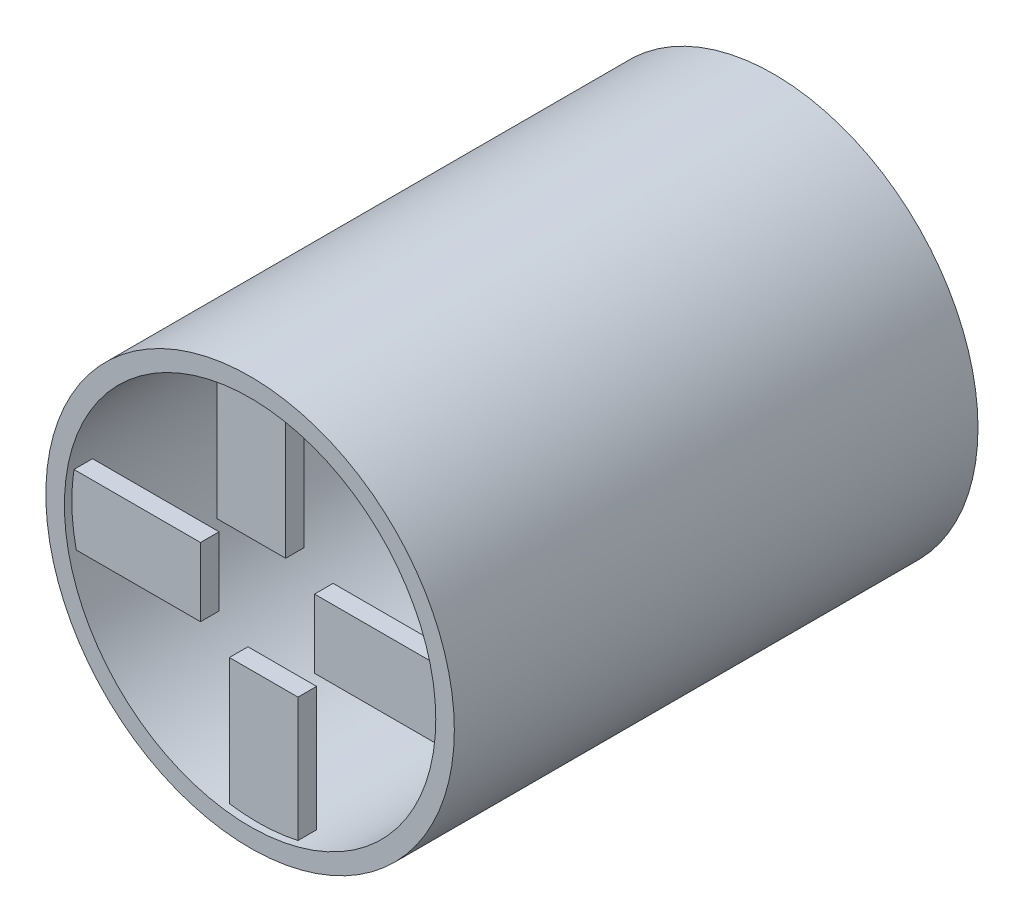
ISO-10303-21;
HEADER;
FILE_DESCRIPTION(('STEP AP214'),'2;1');
FILE_NAME('part.step','',(''),(''),'','','');
FILE_SCHEMA(('AUTOMOTIVE_DESIGN { 1 0 10303 214 1 1 1 1 }'));
ENDSEC;
DATA;
#1=APPLICATION_CONTEXT('core data for automotive mechanical design processes');
#2=APPLICATION_PROTOCOL_DEFINITION('international standard','automotive_design',2000,#1);
#3=PRODUCT_CONTEXT('',#1,'mechanical');
#4=PRODUCT('Part','Part','',(#3));
#5=PRODUCT_RELATED_PRODUCT_CATEGORY('part','',(#4));
#6=PRODUCT_DEFINITION_FORMATION('','',#4);
#7=PRODUCT_DEFINITION_CONTEXT('part definition',#1,'design');
#8=PRODUCT_DEFINITION('design','',#6,#7);
#9=PRODUCT_DEFINITION_SHAPE('','',#8);
#10=(LENGTH_UNIT() NAMED_UNIT(*) SI_UNIT(.MILLI.,.METRE.));
#11=(NAMED_UNIT(*) PLANE_ANGLE_UNIT() SI_UNIT($,.RADIAN.));
#12=(NAMED_UNIT(*) SI_UNIT($,.STERADIAN.) SOLID_ANGLE_UNIT());
#13=UNCERTAINTY_MEASURE_WITH_UNIT(LENGTH_MEASURE(1.E-05),#10,'distance_accuracy_value','');
#14=(GEOMETRIC_REPRESENTATION_CONTEXT(3) GLOBAL_UNCERTAINTY_ASSIGNED_CONTEXT((#13)) GLOBAL_UNIT_ASSIGNED_CONTEXT((#10,
#11,#12)) REPRESENTATION_CONTEXT('',''));
#15=CARTESIAN_POINT('',(0.,0.,0.));
#16=DIRECTION('',(0.,0.,1.));
#17=DIRECTION('',(1.,0.,0.));
#18=AXIS2_PLACEMENT_3D('',#15,#16,#17);
#19=CARTESIAN_POINT('',(0.,0.,6.95));
#20=DIRECTION('',(0.,0.,1.));
#21=DIRECTION('',(1.,0.,0.));
#22=AXIS2_PLACEMENT_3D('',#19,#20,#21);
#23=PLANE('',#22);
#24=DIRECTION('',(0.,-1.,0.));
#25=VECTOR('',#24,1.);
#26=CARTESIAN_POINT('',(0.378691706238011,2.47115207780228,6.95));
#27=LINE('',#26,#25);
#28=CARTESIAN_POINT('',(0.378691706238011,2.47115207780228,6.95));
#29=VERTEX_POINT('',#28);
#30=CARTESIAN_POINT('',(0.378691706238011,0.767744305134912,6.95));
#31=VERTEX_POINT('',#30);
#32=EDGE_CURVE('E162',#29,#31,#27,.T.);
#33=ORIENTED_EDGE('',*,*,#32,.F.);
#34=CARTESIAN_POINT('',(0.,0.,6.95));
#35=DIRECTION('',(0.,0.,1.));
#36=DIRECTION('',(1.,0.,0.));
#37=AXIS2_PLACEMENT_3D('',#34,#35,#36);
#38=CIRCLE('',#37,2.5);
#39=CARTESIAN_POINT('',(-0.544910465352832,2.43989192071062,6.95));
#40=VERTEX_POINT('',#39);
#41=EDGE_CURVE('E11',#29,#40,#38,.T.);
#42=ORIENTED_EDGE('',*,*,#41,.T.);
#43=DIRECTION('',(0.,1.,0.));
#44=VECTOR('',#43,1.);
#45=CARTESIAN_POINT('',(-0.544910465352832,2.43989192071062,6.95));
#46=LINE('',#45,#44);
#47=CARTESIAN_POINT('',(-0.544910465352832,0.767744305134912,6.95));
#48=VERTEX_POINT('',#47);
#49=EDGE_CURVE('E172',#48,#40,#46,.T.);
#50=ORIENTED_EDGE('',*,*,#49,.F.);
#51=DIRECTION('',(-1.,0.,0.));
#52=VECTOR('',#51,1.);
#53=CARTESIAN_POINT('',(-0.544910465352832,0.767744305134912,6.95));
#54=LINE('',#53,#52);
#55=EDGE_CURVE('E170',#31,#48,#54,.T.);
#56=ORIENTED_EDGE('',*,*,#55,.F.);
#57=EDGE_LOOP('',(#33,#42,#50,#56));
#58=FACE_BOUND('',#57,.T.);
#59=ADVANCED_FACE('F33',(#58),#23,.T.);
#60=DIRECTION('',(1.,0.,0.));
#61=VECTOR('',#60,1.);
#62=CARTESIAN_POINT('',(-2.47115207780228,0.378691706238037,6.95));
#63=LINE('',#62,#61);
#64=CARTESIAN_POINT('',(-2.47115207780228,0.378691706238037,6.95));
#65=VERTEX_POINT('',#64);
#66=CARTESIAN_POINT('',(-0.767744305134908,0.378691706238019,6.95));
#67=VERTEX_POINT('',#66);
#68=EDGE_CURVE('E180',#65,#67,#63,.T.);
#69=ORIENTED_EDGE('',*,*,#68,.F.);
#70=CARTESIAN_POINT('',(-2.43989192071062,-0.544910465352806,6.95));
#71=VERTEX_POINT('',#70);
#72=EDGE_CURVE('E42',#65,#71,#38,.T.);
#73=ORIENTED_EDGE('',*,*,#72,.T.);
#74=DIRECTION('',(-1.,0.,0.));
#75=VECTOR('',#74,1.);
#76=CARTESIAN_POINT('',(-2.43989192071062,-0.544910465352806,6.95));
#77=LINE('',#76,#75);
#78=CARTESIAN_POINT('',(-0.767744305134918,-0.544910465352824,6.95));
#79=VERTEX_POINT('',#78);
#80=EDGE_CURVE('E184',#79,#71,#77,.T.);
#81=ORIENTED_EDGE('',*,*,#80,.F.);
#82=DIRECTION('',(0.,-1.,0.));
#83=VECTOR('',#82,1.);
#84=CARTESIAN_POINT('',(-0.767744305134918,-0.544910465352824,6.95));
#85=LINE('',#84,#83);
#86=EDGE_CURVE('E182',#67,#79,#85,.T.);
#87=ORIENTED_EDGE('',*,*,#86,.F.);
#88=EDGE_LOOP('',(#69,#73,#81,#87));
#89=FACE_BOUND('',#88,.T.);
#90=ADVANCED_FACE('F291',(#89),#23,.T.);
#91=DIRECTION('',(0.,1.,0.));
#92=VECTOR('',#91,1.);
#93=CARTESIAN_POINT('',(-0.378691706238029,-2.47115207780228,6.95));
#94=LINE('',#93,#92);
#95=CARTESIAN_POINT('',(-0.378691706238029,-2.47115207780228,6.95));
#96=VERTEX_POINT('',#95);
#97=CARTESIAN_POINT('',(-0.378691706238017,-0.767744305134909,6.95));
#98=VERTEX_POINT('',#97);
#99=EDGE_CURVE('E187',#96,#98,#94,.T.);
#100=ORIENTED_EDGE('',*,*,#99,.F.);
#101=CARTESIAN_POINT('',(0.544910465352815,-2.43989192071062,6.95));
#102=VERTEX_POINT('',#101);
#103=EDGE_CURVE('E320',#96,#102,#38,.T.);
#104=ORIENTED_EDGE('',*,*,#103,.T.);
#105=DIRECTION('',(0.,-1.,0.));
#106=VECTOR('',#105,1.);
#107=CARTESIAN_POINT('',(0.544910465352815,-2.43989192071062,6.95));
#108=LINE('',#107,#106);
#109=CARTESIAN_POINT('',(0.544910465352826,-0.767744305134916,6.95));
#110=VERTEX_POINT('',#109);
#111=EDGE_CURVE('E191',#110,#102,#108,.T.);
#112=ORIENTED_EDGE('',*,*,#111,.F.);
#113=DIRECTION('',(1.,0.,0.));
#114=VECTOR('',#113,1.);
#115=CARTESIAN_POINT('',(0.544910465352826,-0.767744305134916,6.95));
#116=LINE('',#115,#114);
#117=EDGE_CURVE('E189',#98,#110,#116,.T.);
#118=ORIENTED_EDGE('',*,*,#117,.F.);
#119=EDGE_LOOP('',(#100,#104,#112,#118));
#120=FACE_BOUND('',#119,.T.);
#121=ADVANCED_FACE('F296',(#120),#23,.T.);
#122=DIRECTION('',(-1.,0.,0.));
#123=VECTOR('',#122,1.);
#124=CARTESIAN_POINT('',(2.47115207780228,-0.37869170623802,6.95));
#125=LINE('',#124,#123);
#126=CARTESIAN_POINT('',(2.47115207780228,-0.37869170623802,6.95));
#127=VERTEX_POINT('',#126);
#128=CARTESIAN_POINT('',(0.767744305134911,-0.378691706238014,6.95));
#129=VERTEX_POINT('',#128);
#130=EDGE_CURVE('E194',#127,#129,#125,.T.);
#131=ORIENTED_EDGE('',*,*,#130,.F.);
#132=CARTESIAN_POINT('',(2.43989192071062,0.544910465352823,6.95));
#133=VERTEX_POINT('',#132);
#134=EDGE_CURVE('E44',#127,#133,#38,.T.);
#135=ORIENTED_EDGE('',*,*,#134,.T.);
#136=DIRECTION('',(1.,0.,0.));
#137=VECTOR('',#136,1.);
#138=CARTESIAN_POINT('',(2.43989192071062,0.544910465352823,6.95));
#139=LINE('',#138,#137);
#140=CARTESIAN_POINT('',(0.767744305134914,0.544910465352829,6.95));
#141=VERTEX_POINT('',#140);
#142=EDGE_CURVE('E198',#141,#133,#139,.T.);
#143=ORIENTED_EDGE('',*,*,#142,.F.);
#144=DIRECTION('',(0.,1.,0.));
#145=VECTOR('',#144,1.);
#146=CARTESIAN_POINT('',(0.767744305134914,0.544910465352829,6.95));
#147=LINE('',#146,#145);
#148=EDGE_CURVE('E196',#129,#141,#147,.T.);
#149=ORIENTED_EDGE('',*,*,#148,.F.);
#150=EDGE_LOOP('',(#131,#135,#143,#149));
#151=FACE_BOUND('',#150,.T.);
#152=ADVANCED_FACE('F287',(#151),#23,.T.);
#153=CARTESIAN_POINT('',(0.,0.,0.));
#154=DIRECTION('',(0.,0.,1.));
#155=DIRECTION('',(1.,0.,0.));
#156=AXIS2_PLACEMENT_3D('',#153,#154,#155);
#157=PLANE('',#156);
#158=CARTESIAN_POINT('',(0.,0.,0.));
#159=DIRECTION('',(0.,0.,1.));
#160=DIRECTION('',(1.,0.,0.));
#161=AXIS2_PLACEMENT_3D('',#158,#159,#160);
#162=CIRCLE('',#161,2.74968951069284);
#163=CARTESIAN_POINT('',(2.74968951069284,0.,0.));
#164=VERTEX_POINT('',#163);
#165=EDGE_CURVE('E37',#164,#164,#162,.T.);
#166=ORIENTED_EDGE('',*,*,#165,.F.);
#167=EDGE_LOOP('',(#166));
#168=FACE_BOUND('',#167,.T.);
#169=CARTESIAN_POINT('',(0.,0.,0.));
#170=DIRECTION('',(0.,0.,1.));
#171=DIRECTION('',(1.,0.,0.));
#172=AXIS2_PLACEMENT_3D('',#169,#170,#171);
#173=CIRCLE('',#172,2.5);
#174=CARTESIAN_POINT('',(2.5,0.,0.));
#175=VERTEX_POINT('',#174);
#176=EDGE_CURVE('E166',#175,#175,#173,.T.);
#177=ORIENTED_EDGE('',*,*,#176,.T.);
#178=EDGE_LOOP('',(#177));
#179=FACE_BOUND('',#178,.T.);
#180=ADVANCED_FACE('F266',(#168,#179),#157,.F.);
#181=CARTESIAN_POINT('',(0.,0.,6.7));
#182=DIRECTION('',(0.,0.,-1.));
#183=DIRECTION('',(-1.,0.,0.));
#184=AXIS2_PLACEMENT_3D('',#181,#182,#183);
#185=CYLINDRICAL_SURFACE('',#184,2.74968951069284);
#186=ORIENTED_EDGE('',*,*,#165,.T.);
#187=EDGE_LOOP('',(#186));
#188=FACE_BOUND('',#187,.T.);
#189=CARTESIAN_POINT('',(0.,0.,7.05));
#190=DIRECTION('',(0.,0.,1.));
#191=DIRECTION('',(1.,0.,0.));
#192=AXIS2_PLACEMENT_3D('',#189,#190,#191);
#193=CIRCLE('',#192,2.74968951069284);
#194=CARTESIAN_POINT('',(2.74968951069284,0.,7.05));
#195=VERTEX_POINT('',#194);
#196=EDGE_CURVE('E177',#195,#195,#193,.T.);
#197=ORIENTED_EDGE('',*,*,#196,.F.);
#198=EDGE_LOOP('',(#197));
#199=FACE_BOUND('',#198,.T.);
#200=ADVANCED_FACE('F35',(#188,#199),#185,.T.);
#201=CARTESIAN_POINT('',(0.,0.,6.7));
#202=DIRECTION('',(0.,0.,-1.));
#203=DIRECTION('',(-1.,0.,0.));
#204=AXIS2_PLACEMENT_3D('',#201,#202,#203);
#205=CYLINDRICAL_SURFACE('',#204,2.5);
#206=ORIENTED_EDGE('',*,*,#41,.F.);
#207=DIRECTION('',(0.,0.,-1.));
#208=VECTOR('',#207,1.);
#209=CARTESIAN_POINT('',(0.378691706238011,2.47115207780228,6.95));
#210=LINE('',#209,#208);
#211=CARTESIAN_POINT('',(0.378691706238011,2.47115207780228,6.7));
#212=VERTEX_POINT('',#211);
#213=EDGE_CURVE('E153',#29,#212,#210,.T.);
#214=ORIENTED_EDGE('',*,*,#213,.T.);
#215=CARTESIAN_POINT('',(0.,0.,6.7));
#216=DIRECTION('',(0.,0.,1.));
#217=DIRECTION('',(1.,0.,0.));
#218=AXIS2_PLACEMENT_3D('',#215,#216,#217);
#219=CIRCLE('',#218,2.5);
#220=CARTESIAN_POINT('',(-0.544910465352832,2.43989192071062,6.7));
#221=VERTEX_POINT('',#220);
#222=EDGE_CURVE('E262',#212,#221,#219,.T.);
#223=ORIENTED_EDGE('',*,*,#222,.T.);
#224=DIRECTION('',(0.,0.,-1.));
#225=VECTOR('',#224,1.);
#226=CARTESIAN_POINT('',(-0.544910465352832,2.43989192071062,6.95));
#227=LINE('',#226,#225);
#228=EDGE_CURVE('E154',#40,#221,#227,.T.);
#229=ORIENTED_EDGE('',*,*,#228,.F.);
#230=EDGE_LOOP('',(#206,#214,#223,#229));
#231=FACE_BOUND('',#230,.T.);
#232=ORIENTED_EDGE('',*,*,#72,.F.);
#233=DIRECTION('',(0.,0.,-1.));
#234=VECTOR('',#233,1.);
#235=CARTESIAN_POINT('',(-2.47115207780228,0.378691706238037,6.95));
#236=LINE('',#235,#234);
#237=CARTESIAN_POINT('',(-2.47115207780228,0.378691706238037,6.7));
#238=VERTEX_POINT('',#237);
#239=EDGE_CURVE('E252',#65,#238,#236,.T.);
#240=ORIENTED_EDGE('',*,*,#239,.T.);
#241=CARTESIAN_POINT('',(-2.43989192071062,-0.544910465352806,6.7));
#242=VERTEX_POINT('',#241);
#243=EDGE_CURVE('E322',#238,#242,#219,.T.);
#244=ORIENTED_EDGE('',*,*,#243,.T.);
#245=DIRECTION('',(0.,0.,-1.));
#246=VECTOR('',#245,1.);
#247=CARTESIAN_POINT('',(-2.43989192071062,-0.544910465352806,6.95));
#248=LINE('',#247,#246);
#249=EDGE_CURVE('E246',#71,#242,#248,.T.);
#250=ORIENTED_EDGE('',*,*,#249,.F.);
#251=EDGE_LOOP('',(#232,#240,#244,#250));
#252=FACE_BOUND('',#251,.T.);
#253=ORIENTED_EDGE('',*,*,#103,.F.);
#254=DIRECTION('',(0.,0.,-1.));
#255=VECTOR('',#254,1.);
#256=CARTESIAN_POINT('',(-0.37869170623803,-2.47115207780228,6.95));
#257=LINE('',#256,#255);
#258=CARTESIAN_POINT('',(-0.37869170623803,-2.47115207780228,6.7));
#259=VERTEX_POINT('',#258);
#260=EDGE_CURVE('E243',#96,#259,#257,.T.);
#261=ORIENTED_EDGE('',*,*,#260,.T.);
#262=CARTESIAN_POINT('',(0.544910465352815,-2.43989192071062,6.7));
#263=VERTEX_POINT('',#262);
#264=EDGE_CURVE('E261',#259,#263,#219,.T.);
#265=ORIENTED_EDGE('',*,*,#264,.T.);
#266=DIRECTION('',(0.,0.,-1.));
#267=VECTOR('',#266,1.);
#268=CARTESIAN_POINT('',(0.544910465352815,-2.43989192071062,6.95));
#269=LINE('',#268,#267);
#270=EDGE_CURVE('E237',#102,#263,#269,.T.);
#271=ORIENTED_EDGE('',*,*,#270,.F.);
#272=EDGE_LOOP('',(#253,#261,#265,#271));
#273=FACE_BOUND('',#272,.T.);
#274=CARTESIAN_POINT('',(2.47115207780228,-0.378691706238021,6.7));
#275=VERTEX_POINT('',#274);
#276=CARTESIAN_POINT('',(2.43989192071062,0.544910465352823,6.7));
#277=VERTEX_POINT('',#276);
#278=EDGE_CURVE('E259',#275,#277,#219,.T.);
#279=ORIENTED_EDGE('',*,*,#278,.T.);
#280=DIRECTION('',(0.,0.,-1.));
#281=VECTOR('',#280,1.);
#282=CARTESIAN_POINT('',(2.43989192071062,0.544910465352823,6.95));
#283=LINE('',#282,#281);
#284=EDGE_CURVE('E200',#133,#277,#283,.T.);
#285=ORIENTED_EDGE('',*,*,#284,.F.);
#286=ORIENTED_EDGE('',*,*,#134,.F.);
#287=DIRECTION('',(0.,0.,-1.));
#288=VECTOR('',#287,1.);
#289=CARTESIAN_POINT('',(2.47115207780228,-0.378691706238021,6.95));
#290=LINE('',#289,#288);
#291=EDGE_CURVE('E234',#127,#275,#290,.T.);
#292=ORIENTED_EDGE('',*,*,#291,.T.);
#293=EDGE_LOOP('',(#279,#285,#286,#292));
#294=FACE_BOUND('',#293,.T.);
#295=ORIENTED_EDGE('',*,*,#176,.F.);
#296=EDGE_LOOP('',(#295));
#297=FACE_BOUND('',#296,.T.);
#298=CARTESIAN_POINT('',(0.,0.,7.05));
#299=DIRECTION('',(0.,0.,1.));
#300=DIRECTION('',(1.,0.,0.));
#301=AXIS2_PLACEMENT_3D('',#298,#299,#300);
#302=CIRCLE('',#301,2.5);
#303=CARTESIAN_POINT('',(2.5,0.,7.05));
#304=VERTEX_POINT('',#303);
#305=EDGE_CURVE('E274',#304,#304,#302,.T.);
#306=ORIENTED_EDGE('',*,*,#305,.T.);
#307=EDGE_LOOP('',(#306));
#308=FACE_BOUND('',#307,.T.);
#309=ADVANCED_FACE('F150',(#231,#252,#273,#294,#297,#308),#205,.F.);
#310=CARTESIAN_POINT('',(0.,0.,6.7));
#311=DIRECTION('',(0.,0.,1.));
#312=DIRECTION('',(1.,0.,0.));
#313=AXIS2_PLACEMENT_3D('',#310,#311,#312);
#314=PLANE('',#313);
#315=ORIENTED_EDGE('',*,*,#222,.F.);
#316=DIRECTION('',(0.,-1.,0.));
#317=VECTOR('',#316,1.);
#318=CARTESIAN_POINT('',(0.378691706238011,2.47115207780228,6.7));
#319=LINE('',#318,#317);
#320=CARTESIAN_POINT('',(0.378691706238011,0.767744305134912,6.7));
#321=VERTEX_POINT('',#320);
#322=EDGE_CURVE('E165',#212,#321,#319,.T.);
#323=ORIENTED_EDGE('',*,*,#322,.T.);
#324=DIRECTION('',(-1.,0.,0.));
#325=VECTOR('',#324,1.);
#326=CARTESIAN_POINT('',(-0.544910465352832,0.767744305134912,6.7));
#327=LINE('',#326,#325);
#328=CARTESIAN_POINT('',(-0.544910465352832,0.767744305134912,6.7));
#329=VERTEX_POINT('',#328);
#330=EDGE_CURVE('E202',#321,#329,#327,.T.);
#331=ORIENTED_EDGE('',*,*,#330,.T.);
#332=DIRECTION('',(0.,1.,0.));
#333=VECTOR('',#332,1.);
#334=CARTESIAN_POINT('',(-0.544910465352832,2.43989192071062,6.7));
#335=LINE('',#334,#333);
#336=EDGE_CURVE('E205',#329,#221,#335,.T.);
#337=ORIENTED_EDGE('',*,*,#336,.T.);
#338=EDGE_LOOP('',(#315,#323,#331,#337));
#339=FACE_BOUND('',#338,.T.);
#340=ADVANCED_FACE('F270',(#339),#314,.F.);
#341=ORIENTED_EDGE('',*,*,#243,.F.);
#342=DIRECTION('',(1.,0.,0.));
#343=VECTOR('',#342,1.);
#344=CARTESIAN_POINT('',(-2.47115207780228,0.378691706238037,6.7));
#345=LINE('',#344,#343);
#346=CARTESIAN_POINT('',(-0.767744305134908,0.378691706238019,6.7));
#347=VERTEX_POINT('',#346);
#348=EDGE_CURVE('E208',#238,#347,#345,.T.);
#349=ORIENTED_EDGE('',*,*,#348,.T.);
#350=DIRECTION('',(0.,-1.,0.));
#351=VECTOR('',#350,1.);
#352=CARTESIAN_POINT('',(-0.767744305134918,-0.544910465352824,6.7));
#353=LINE('',#352,#351);
#354=CARTESIAN_POINT('',(-0.767744305134918,-0.544910465352824,6.7));
#355=VERTEX_POINT('',#354);
#356=EDGE_CURVE('E211',#347,#355,#353,.T.);
#357=ORIENTED_EDGE('',*,*,#356,.T.);
#358=DIRECTION('',(-1.,0.,0.));
#359=VECTOR('',#358,1.);
#360=CARTESIAN_POINT('',(-2.43989192071062,-0.544910465352806,6.7));
#361=LINE('',#360,#359);
#362=EDGE_CURVE('E214',#355,#242,#361,.T.);
#363=ORIENTED_EDGE('',*,*,#362,.T.);
#364=EDGE_LOOP('',(#341,#349,#357,#363));
#365=FACE_BOUND('',#364,.T.);
#366=ADVANCED_FACE('F381',(#365),#314,.F.);
#367=ORIENTED_EDGE('',*,*,#264,.F.);
#368=DIRECTION('',(0.,1.,0.));
#369=VECTOR('',#368,1.);
#370=CARTESIAN_POINT('',(-0.378691706238029,-2.47115207780228,6.7));
#371=LINE('',#370,#369);
#372=CARTESIAN_POINT('',(-0.378691706238017,-0.767744305134909,6.7));
#373=VERTEX_POINT('',#372);
#374=EDGE_CURVE('E217',#259,#373,#371,.T.);
#375=ORIENTED_EDGE('',*,*,#374,.T.);
#376=DIRECTION('',(1.,0.,0.));
#377=VECTOR('',#376,1.);
#378=CARTESIAN_POINT('',(0.544910465352826,-0.767744305134916,6.7));
#379=LINE('',#378,#377);
#380=CARTESIAN_POINT('',(0.544910465352826,-0.767744305134916,6.7));
#381=VERTEX_POINT('',#380);
#382=EDGE_CURVE('E220',#373,#381,#379,.T.);
#383=ORIENTED_EDGE('',*,*,#382,.T.);
#384=DIRECTION('',(0.,-1.,0.));
#385=VECTOR('',#384,1.);
#386=CARTESIAN_POINT('',(0.544910465352815,-2.43989192071062,6.7));
#387=LINE('',#386,#385);
#388=EDGE_CURVE('E223',#381,#263,#387,.T.);
#389=ORIENTED_EDGE('',*,*,#388,.T.);
#390=EDGE_LOOP('',(#367,#375,#383,#389));
#391=FACE_BOUND('',#390,.T.);
#392=ADVANCED_FACE('F331',(#391),#314,.F.);
#393=ORIENTED_EDGE('',*,*,#278,.F.);
#394=DIRECTION('',(-1.,0.,0.));
#395=VECTOR('',#394,1.);
#396=CARTESIAN_POINT('',(2.47115207780228,-0.37869170623802,6.7));
#397=LINE('',#396,#395);
#398=CARTESIAN_POINT('',(0.767744305134911,-0.378691706238014,6.7));
#399=VERTEX_POINT('',#398);
#400=EDGE_CURVE('E226',#275,#399,#397,.T.);
#401=ORIENTED_EDGE('',*,*,#400,.T.);
#402=DIRECTION('',(0.,1.,0.));
#403=VECTOR('',#402,1.);
#404=CARTESIAN_POINT('',(0.767744305134914,0.544910465352829,6.7));
#405=LINE('',#404,#403);
#406=CARTESIAN_POINT('',(0.767744305134914,0.544910465352829,6.7));
#407=VERTEX_POINT('',#406);
#408=EDGE_CURVE('E174',#399,#407,#405,.T.);
#409=ORIENTED_EDGE('',*,*,#408,.T.);
#410=DIRECTION('',(1.,0.,0.));
#411=VECTOR('',#410,1.);
#412=CARTESIAN_POINT('',(2.43989192071062,0.544910465352823,6.7));
#413=LINE('',#412,#411);
#414=EDGE_CURVE('E51',#407,#277,#413,.T.);
#415=ORIENTED_EDGE('',*,*,#414,.T.);
#416=EDGE_LOOP('',(#393,#401,#409,#415));
#417=FACE_BOUND('',#416,.T.);
#418=ADVANCED_FACE('F317',(#417),#314,.F.);
#419=CARTESIAN_POINT('',(0.378691706238011,2.47115207780228,6.95));
#420=DIRECTION('',(1.,0.,0.));
#421=DIRECTION('',(0.,1.,0.));
#422=AXIS2_PLACEMENT_3D('',#419,#420,#421);
#423=PLANE('',#422);
#424=ORIENTED_EDGE('',*,*,#322,.F.);
#425=ORIENTED_EDGE('',*,*,#213,.F.);
#426=ORIENTED_EDGE('',*,*,#32,.T.);
#427=DIRECTION('',(0.,0.,-1.));
#428=VECTOR('',#427,1.);
#429=CARTESIAN_POINT('',(0.378691706238011,0.767744305134912,6.95));
#430=LINE('',#429,#428);
#431=EDGE_CURVE('E167',#31,#321,#430,.T.);
#432=ORIENTED_EDGE('',*,*,#431,.T.);
#433=EDGE_LOOP('',(#424,#425,#426,#432));
#434=FACE_BOUND('',#433,.T.);
#435=ADVANCED_FACE('F161',(#434),#423,.T.);
#436=CARTESIAN_POINT('',(-0.544910465352832,0.767744305134912,6.95));
#437=DIRECTION('',(0.,-1.,0.));
#438=DIRECTION('',(0.,0.,-1.));
#439=AXIS2_PLACEMENT_3D('',#436,#437,#438);
#440=PLANE('',#439);
#441=ORIENTED_EDGE('',*,*,#330,.F.);
#442=ORIENTED_EDGE('',*,*,#431,.F.);
#443=ORIENTED_EDGE('',*,*,#55,.T.);
#444=DIRECTION('',(0.,0.,-1.));
#445=VECTOR('',#444,1.);
#446=CARTESIAN_POINT('',(-0.544910465352832,0.767744305134912,6.95));
#447=LINE('',#446,#445);
#448=EDGE_CURVE('E256',#48,#329,#447,.T.);
#449=ORIENTED_EDGE('',*,*,#448,.T.);
#450=EDGE_LOOP('',(#441,#442,#443,#449));
#451=FACE_BOUND('',#450,.T.);
#452=ADVANCED_FACE('F370',(#451),#440,.T.);
#453=CARTESIAN_POINT('',(-0.544910465352832,2.43989192071062,6.95));
#454=DIRECTION('',(-1.,0.,0.));
#455=DIRECTION('',(0.,-1.,0.));
#456=AXIS2_PLACEMENT_3D('',#453,#454,#455);
#457=PLANE('',#456);
#458=ORIENTED_EDGE('',*,*,#336,.F.);
#459=ORIENTED_EDGE('',*,*,#448,.F.);
#460=ORIENTED_EDGE('',*,*,#49,.T.);
#461=ORIENTED_EDGE('',*,*,#228,.T.);
#462=EDGE_LOOP('',(#458,#459,#460,#461));
#463=FACE_BOUND('',#462,.T.);
#464=ADVANCED_FACE('F366',(#463),#457,.T.);
#465=CARTESIAN_POINT('',(-2.47115207780228,0.378691706238037,6.95));
#466=DIRECTION('',(0.,1.,0.));
#467=DIRECTION('',(-1.,0.,0.));
#468=AXIS2_PLACEMENT_3D('',#465,#466,#467);
#469=PLANE('',#468);
#470=ORIENTED_EDGE('',*,*,#348,.F.);
#471=ORIENTED_EDGE('',*,*,#239,.F.);
#472=ORIENTED_EDGE('',*,*,#68,.T.);
#473=DIRECTION('',(0.,0.,-1.));
#474=VECTOR('',#473,1.);
#475=CARTESIAN_POINT('',(-0.767744305134908,0.378691706238019,6.95));
#476=LINE('',#475,#474);
#477=EDGE_CURVE('E250',#67,#347,#476,.T.);
#478=ORIENTED_EDGE('',*,*,#477,.T.);
#479=EDGE_LOOP('',(#470,#471,#472,#478));
#480=FACE_BOUND('',#479,.T.);
#481=ADVANCED_FACE('F362',(#480),#469,.T.);
#482=CARTESIAN_POINT('',(-0.767744305134918,-0.544910465352824,6.95));
#483=DIRECTION('',(1.,0.,0.));
#484=DIRECTION('',(0.,1.,0.));
#485=AXIS2_PLACEMENT_3D('',#482,#483,#484);
#486=PLANE('',#485);
#487=ORIENTED_EDGE('',*,*,#356,.F.);
#488=ORIENTED_EDGE('',*,*,#477,.F.);
#489=ORIENTED_EDGE('',*,*,#86,.T.);
#490=DIRECTION('',(0.,0.,-1.));
#491=VECTOR('',#490,1.);
#492=CARTESIAN_POINT('',(-0.767744305134918,-0.544910465352824,6.95));
#493=LINE('',#492,#491);
#494=EDGE_CURVE('E248',#79,#355,#493,.T.);
#495=ORIENTED_EDGE('',*,*,#494,.T.);
#496=EDGE_LOOP('',(#487,#488,#489,#495));
#497=FACE_BOUND('',#496,.T.);
#498=ADVANCED_FACE('F358',(#497),#486,.T.);
#499=CARTESIAN_POINT('',(-2.43989192071062,-0.544910465352806,6.95));
#500=DIRECTION('',(0.,-1.,0.));
#501=DIRECTION('',(1.,0.,0.));
#502=AXIS2_PLACEMENT_3D('',#499,#500,#501);
#503=PLANE('',#502);
#504=ORIENTED_EDGE('',*,*,#362,.F.);
#505=ORIENTED_EDGE('',*,*,#494,.F.);
#506=ORIENTED_EDGE('',*,*,#80,.T.);
#507=ORIENTED_EDGE('',*,*,#249,.T.);
#508=EDGE_LOOP('',(#504,#505,#506,#507));
#509=FACE_BOUND('',#508,.T.);
#510=ADVANCED_FACE('F352',(#509),#503,.T.);
#511=CARTESIAN_POINT('',(-0.378691706238029,-2.47115207780228,6.95));
#512=DIRECTION('',(-1.,0.,0.));
#513=DIRECTION('',(0.,-1.,0.));
#514=AXIS2_PLACEMENT_3D('',#511,#512,#513);
#515=PLANE('',#514);
#516=ORIENTED_EDGE('',*,*,#374,.F.);
#517=ORIENTED_EDGE('',*,*,#260,.F.);
#518=ORIENTED_EDGE('',*,*,#99,.T.);
#519=DIRECTION('',(0.,0.,-1.));
#520=VECTOR('',#519,1.);
#521=CARTESIAN_POINT('',(-0.378691706238017,-0.767744305134909,6.95));
#522=LINE('',#521,#520);
#523=EDGE_CURVE('E241',#98,#373,#522,.T.);
#524=ORIENTED_EDGE('',*,*,#523,.T.);
#525=EDGE_LOOP('',(#516,#517,#518,#524));
#526=FACE_BOUND('',#525,.T.);
#527=ADVANCED_FACE('F341',(#526),#515,.T.);
#528=CARTESIAN_POINT('',(0.544910465352826,-0.767744305134916,6.95));
#529=DIRECTION('',(0.,1.,0.));
#530=DIRECTION('',(-1.,0.,0.));
#531=AXIS2_PLACEMENT_3D('',#528,#529,#530);
#532=PLANE('',#531);
#533=ORIENTED_EDGE('',*,*,#382,.F.);
#534=ORIENTED_EDGE('',*,*,#523,.F.);
#535=ORIENTED_EDGE('',*,*,#117,.T.);
#536=DIRECTION('',(0.,0.,-1.));
#537=VECTOR('',#536,1.);
#538=CARTESIAN_POINT('',(0.544910465352826,-0.767744305134916,6.95));
#539=LINE('',#538,#537);
#540=EDGE_CURVE('E239',#110,#381,#539,.T.);
#541=ORIENTED_EDGE('',*,*,#540,.T.);
#542=EDGE_LOOP('',(#533,#534,#535,#541));
#543=FACE_BOUND('',#542,.T.);
#544=ADVANCED_FACE('F344',(#543),#532,.T.);
#545=CARTESIAN_POINT('',(0.544910465352815,-2.43989192071062,6.95));
#546=DIRECTION('',(1.,0.,0.));
#547=DIRECTION('',(0.,1.,0.));
#548=AXIS2_PLACEMENT_3D('',#545,#546,#547);
#549=PLANE('',#548);
#550=ORIENTED_EDGE('',*,*,#388,.F.);
#551=ORIENTED_EDGE('',*,*,#540,.F.);
#552=ORIENTED_EDGE('',*,*,#111,.T.);
#553=ORIENTED_EDGE('',*,*,#270,.T.);
#554=EDGE_LOOP('',(#550,#551,#552,#553));
#555=FACE_BOUND('',#554,.T.);
#556=ADVANCED_FACE('F336',(#555),#549,.T.);
#557=CARTESIAN_POINT('',(2.47115207780228,-0.37869170623802,6.95));
#558=DIRECTION('',(0.,-1.,0.));
#559=DIRECTION('',(1.,0.,0.));
#560=AXIS2_PLACEMENT_3D('',#557,#558,#559);
#561=PLANE('',#560);
#562=ORIENTED_EDGE('',*,*,#400,.F.);
#563=ORIENTED_EDGE('',*,*,#291,.F.);
#564=ORIENTED_EDGE('',*,*,#130,.T.);
#565=DIRECTION('',(0.,0.,-1.));
#566=VECTOR('',#565,1.);
#567=CARTESIAN_POINT('',(0.767744305134911,-0.378691706238014,6.95));
#568=LINE('',#567,#566);
#569=EDGE_CURVE('E232',#129,#399,#568,.T.);
#570=ORIENTED_EDGE('',*,*,#569,.T.);
#571=EDGE_LOOP('',(#562,#563,#564,#570));
#572=FACE_BOUND('',#571,.T.);
#573=ADVANCED_FACE('F313',(#572),#561,.T.);
#574=CARTESIAN_POINT('',(0.767744305134914,0.544910465352829,6.95));
#575=DIRECTION('',(-1.,0.,0.));
#576=DIRECTION('',(0.,-1.,0.));
#577=AXIS2_PLACEMENT_3D('',#574,#575,#576);
#578=PLANE('',#577);
#579=ORIENTED_EDGE('',*,*,#408,.F.);
#580=ORIENTED_EDGE('',*,*,#569,.F.);
#581=ORIENTED_EDGE('',*,*,#148,.T.);
#582=DIRECTION('',(0.,0.,-1.));
#583=VECTOR('',#582,1.);
#584=CARTESIAN_POINT('',(0.767744305134914,0.544910465352829,6.95));
#585=LINE('',#584,#583);
#586=EDGE_CURVE('E58',#141,#407,#585,.T.);
#587=ORIENTED_EDGE('',*,*,#586,.T.);
#588=EDGE_LOOP('',(#579,#580,#581,#587));
#589=FACE_BOUND('',#588,.T.);
#590=ADVANCED_FACE('F316',(#589),#578,.T.);
#591=CARTESIAN_POINT('',(2.43989192071062,0.544910465352823,6.95));
#592=DIRECTION('',(0.,1.,0.));
#593=DIRECTION('',(-1.,0.,0.));
#594=AXIS2_PLACEMENT_3D('',#591,#592,#593);
#595=PLANE('',#594);
#596=ORIENTED_EDGE('',*,*,#414,.F.);
#597=ORIENTED_EDGE('',*,*,#586,.F.);
#598=ORIENTED_EDGE('',*,*,#142,.T.);
#599=ORIENTED_EDGE('',*,*,#284,.T.);
#600=EDGE_LOOP('',(#596,#597,#598,#599));
#601=FACE_BOUND('',#600,.T.);
#602=ADVANCED_FACE('F440',(#601),#595,.T.);
#603=CARTESIAN_POINT('',(0.,0.,7.05));
#604=DIRECTION('',(0.,0.,1.));
#605=DIRECTION('',(1.,0.,0.));
#606=AXIS2_PLACEMENT_3D('',#603,#604,#605);
#607=PLANE('',#606);
#608=ORIENTED_EDGE('',*,*,#196,.T.);
#609=EDGE_LOOP('',(#608));
#610=FACE_BOUND('',#609,.T.);
#611=ORIENTED_EDGE('',*,*,#305,.F.);
#612=EDGE_LOOP('',(#611));
#613=FACE_BOUND('',#612,.T.);
#614=ADVANCED_FACE('F280',(#610,#613),#607,.T.);
#615=CLOSED_SHELL('',(#59,#90,#121,#152,#180,#200,#309,#340,#366,#392,#418,#435,#452,#464,#481,
#498,#510,#527,#544,#556,#573,#590,#602,#614));
#616=MANIFOLD_SOLID_BREP('B2',#615);
#617=ADVANCED_BREP_SHAPE_REPRESENTATION('',(#18,#616),#14);
#618=SHAPE_DEFINITION_REPRESENTATION(#9,#617);
ENDSEC;
END-ISO-10303-21;
